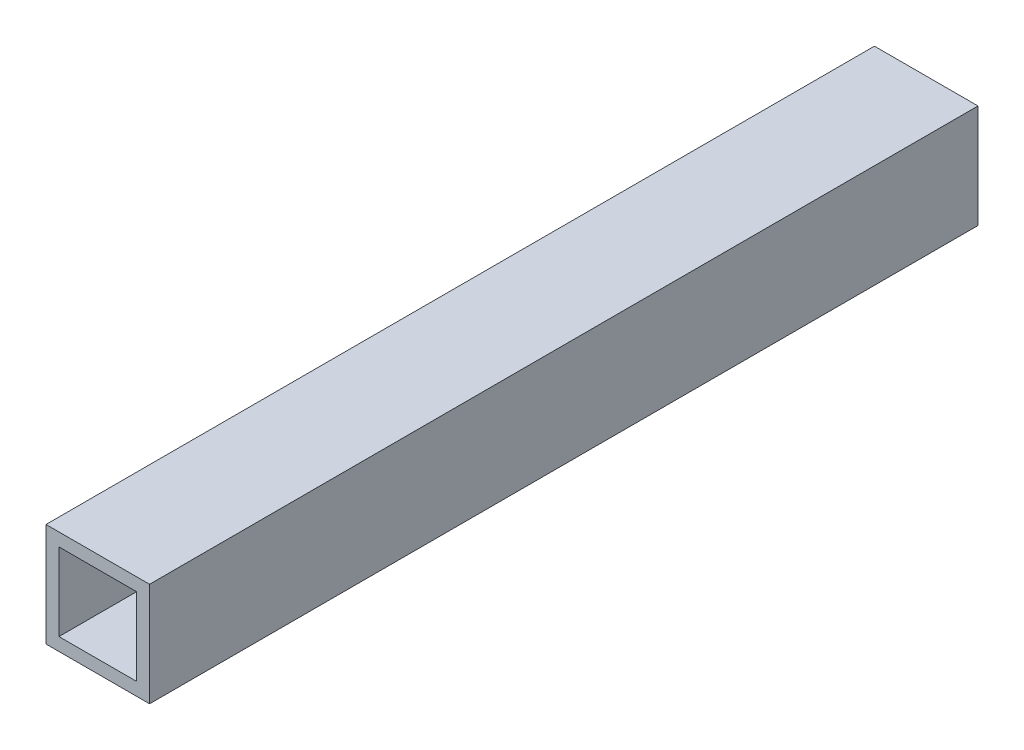
ISO-10303-21;
HEADER;
FILE_DESCRIPTION(('STEP AP214'),'2;1');
FILE_NAME('part.step','',(''),(''),'','','');
FILE_SCHEMA(('AUTOMOTIVE_DESIGN { 1 0 10303 214 1 1 1 1 }'));
ENDSEC;
DATA;
#1=APPLICATION_CONTEXT('core data for automotive mechanical design processes');
#2=APPLICATION_PROTOCOL_DEFINITION('international standard','automotive_design',2000,#1);
#3=PRODUCT_CONTEXT('',#1,'mechanical');
#4=PRODUCT('Part','Part','',(#3));
#5=PRODUCT_RELATED_PRODUCT_CATEGORY('part','',(#4));
#6=PRODUCT_DEFINITION_FORMATION('','',#4);
#7=PRODUCT_DEFINITION_CONTEXT('part definition',#1,'design');
#8=PRODUCT_DEFINITION('design','',#6,#7);
#9=PRODUCT_DEFINITION_SHAPE('','',#8);
#10=(LENGTH_UNIT() NAMED_UNIT(*) SI_UNIT(.MILLI.,.METRE.));
#11=(NAMED_UNIT(*) PLANE_ANGLE_UNIT() SI_UNIT($,.RADIAN.));
#12=(NAMED_UNIT(*) SI_UNIT($,.STERADIAN.) SOLID_ANGLE_UNIT());
#13=UNCERTAINTY_MEASURE_WITH_UNIT(LENGTH_MEASURE(1.E-05),#10,'distance_accuracy_value','');
#14=(GEOMETRIC_REPRESENTATION_CONTEXT(3) GLOBAL_UNCERTAINTY_ASSIGNED_CONTEXT((#13)) GLOBAL_UNIT_ASSIGNED_CONTEXT((#10,
#11,#12)) REPRESENTATION_CONTEXT('',''));
#15=CARTESIAN_POINT('',(0.,0.,0.));
#16=DIRECTION('',(0.,0.,1.));
#17=DIRECTION('',(1.,0.,0.));
#18=AXIS2_PLACEMENT_3D('',#15,#16,#17);
#19=CARTESIAN_POINT('',(0.,0.,203.2));
#20=DIRECTION('',(0.,0.,1.));
#21=DIRECTION('',(1.,0.,0.));
#22=AXIS2_PLACEMENT_3D('',#19,#20,#21);
#23=PLANE('',#22);
#24=DIRECTION('',(0.,-1.,0.));
#25=VECTOR('',#24,1.);
#26=CARTESIAN_POINT('',(-12.7,-12.7,203.2));
#27=LINE('',#26,#25);
#28=CARTESIAN_POINT('',(-12.7,12.7,203.2));
#29=VERTEX_POINT('',#28);
#30=CARTESIAN_POINT('',(-12.7,-12.7,203.2));
#31=VERTEX_POINT('',#30);
#32=EDGE_CURVE('E133',#29,#31,#27,.T.);
#33=ORIENTED_EDGE('',*,*,#32,.T.);
#34=DIRECTION('',(1.,0.,0.));
#35=VECTOR('',#34,1.);
#36=CARTESIAN_POINT('',(12.7,-12.7,203.2));
#37=LINE('',#36,#35);
#38=CARTESIAN_POINT('',(12.7,-12.7,203.2));
#39=VERTEX_POINT('',#38);
#40=EDGE_CURVE('E136',#31,#39,#37,.T.);
#41=ORIENTED_EDGE('',*,*,#40,.T.);
#42=DIRECTION('',(0.,1.,0.));
#43=VECTOR('',#42,1.);
#44=CARTESIAN_POINT('',(12.7,-12.7,203.2));
#45=LINE('',#44,#43);
#46=CARTESIAN_POINT('',(12.7,12.7,203.2));
#47=VERTEX_POINT('',#46);
#48=EDGE_CURVE('E139',#39,#47,#45,.T.);
#49=ORIENTED_EDGE('',*,*,#48,.T.);
#50=DIRECTION('',(-1.,0.,0.));
#51=VECTOR('',#50,1.);
#52=CARTESIAN_POINT('',(12.7,12.7,203.2));
#53=LINE('',#52,#51);
#54=EDGE_CURVE('E141',#47,#29,#53,.T.);
#55=ORIENTED_EDGE('',*,*,#54,.T.);
#56=EDGE_LOOP('',(#33,#41,#49,#55));
#57=FACE_BOUND('',#56,.T.);
#58=DIRECTION('',(1.,0.,0.));
#59=VECTOR('',#58,1.);
#60=CARTESIAN_POINT('',(9.525,-9.525,203.2));
#61=LINE('',#60,#59);
#62=CARTESIAN_POINT('',(-9.525,-9.525,203.2));
#63=VERTEX_POINT('',#62);
#64=CARTESIAN_POINT('',(9.525,-9.525,203.2));
#65=VERTEX_POINT('',#64);
#66=EDGE_CURVE('E105',#63,#65,#61,.T.);
#67=ORIENTED_EDGE('',*,*,#66,.F.);
#68=DIRECTION('',(0.,-1.,0.));
#69=VECTOR('',#68,1.);
#70=CARTESIAN_POINT('',(-9.525,-9.525,203.2));
#71=LINE('',#70,#69);
#72=CARTESIAN_POINT('',(-9.525,9.52500000000001,203.2));
#73=VERTEX_POINT('',#72);
#74=EDGE_CURVE('E97',#73,#63,#71,.T.);
#75=ORIENTED_EDGE('',*,*,#74,.F.);
#76=DIRECTION('',(-1.,0.,0.));
#77=VECTOR('',#76,1.);
#78=CARTESIAN_POINT('',(9.525,9.52500000000001,203.2));
#79=LINE('',#78,#77);
#80=CARTESIAN_POINT('',(9.525,9.52500000000001,203.2));
#81=VERTEX_POINT('',#80);
#82=EDGE_CURVE('E119',#81,#73,#79,.T.);
#83=ORIENTED_EDGE('',*,*,#82,.F.);
#84=DIRECTION('',(0.,1.,0.));
#85=VECTOR('',#84,1.);
#86=CARTESIAN_POINT('',(9.525,-9.525,203.2));
#87=LINE('',#86,#85);
#88=EDGE_CURVE('E117',#65,#81,#87,.T.);
#89=ORIENTED_EDGE('',*,*,#88,.F.);
#90=EDGE_LOOP('',(#67,#75,#83,#89));
#91=FACE_BOUND('',#90,.T.);
#92=ADVANCED_FACE('F32',(#57,#91),#23,.T.);
#93=CARTESIAN_POINT('',(0.,0.,0.));
#94=DIRECTION('',(0.,0.,1.));
#95=DIRECTION('',(1.,0.,0.));
#96=AXIS2_PLACEMENT_3D('',#93,#94,#95);
#97=PLANE('',#96);
#98=DIRECTION('',(0.,-1.,0.));
#99=VECTOR('',#98,1.);
#100=CARTESIAN_POINT('',(-12.7,-12.7,0.));
#101=LINE('',#100,#99);
#102=CARTESIAN_POINT('',(-12.7,12.7,0.));
#103=VERTEX_POINT('',#102);
#104=CARTESIAN_POINT('',(-12.7,-12.7,0.));
#105=VERTEX_POINT('',#104);
#106=EDGE_CURVE('E113',#103,#105,#101,.T.);
#107=ORIENTED_EDGE('',*,*,#106,.F.);
#108=DIRECTION('',(-1.,0.,0.));
#109=VECTOR('',#108,1.);
#110=CARTESIAN_POINT('',(12.7,12.7,0.));
#111=LINE('',#110,#109);
#112=CARTESIAN_POINT('',(12.7,12.7,0.));
#113=VERTEX_POINT('',#112);
#114=EDGE_CURVE('E137',#113,#103,#111,.T.);
#115=ORIENTED_EDGE('',*,*,#114,.F.);
#116=DIRECTION('',(0.,1.,0.));
#117=VECTOR('',#116,1.);
#118=CARTESIAN_POINT('',(12.7,-12.7,0.));
#119=LINE('',#118,#117);
#120=CARTESIAN_POINT('',(12.7,-12.7,0.));
#121=VERTEX_POINT('',#120);
#122=EDGE_CURVE('E148',#121,#113,#119,.T.);
#123=ORIENTED_EDGE('',*,*,#122,.F.);
#124=DIRECTION('',(1.,0.,0.));
#125=VECTOR('',#124,1.);
#126=CARTESIAN_POINT('',(12.7,-12.7,0.));
#127=LINE('',#126,#125);
#128=EDGE_CURVE('E146',#105,#121,#127,.T.);
#129=ORIENTED_EDGE('',*,*,#128,.F.);
#130=EDGE_LOOP('',(#107,#115,#123,#129));
#131=FACE_BOUND('',#130,.T.);
#132=DIRECTION('',(0.,-1.,0.));
#133=VECTOR('',#132,1.);
#134=CARTESIAN_POINT('',(-9.525,-9.525,0.));
#135=LINE('',#134,#133);
#136=CARTESIAN_POINT('',(-9.525,9.52500000000001,0.));
#137=VERTEX_POINT('',#136);
#138=CARTESIAN_POINT('',(-9.525,-9.525,0.));
#139=VERTEX_POINT('',#138);
#140=EDGE_CURVE('E55',#137,#139,#135,.T.);
#141=ORIENTED_EDGE('',*,*,#140,.T.);
#142=DIRECTION('',(1.,0.,0.));
#143=VECTOR('',#142,1.);
#144=CARTESIAN_POINT('',(9.525,-9.525,0.));
#145=LINE('',#144,#143);
#146=CARTESIAN_POINT('',(9.525,-9.525,0.));
#147=VERTEX_POINT('',#146);
#148=EDGE_CURVE('E112',#139,#147,#145,.T.);
#149=ORIENTED_EDGE('',*,*,#148,.T.);
#150=DIRECTION('',(0.,1.,0.));
#151=VECTOR('',#150,1.);
#152=CARTESIAN_POINT('',(9.525,-9.525,0.));
#153=LINE('',#152,#151);
#154=CARTESIAN_POINT('',(9.525,9.52500000000001,0.));
#155=VERTEX_POINT('',#154);
#156=EDGE_CURVE('E125',#147,#155,#153,.T.);
#157=ORIENTED_EDGE('',*,*,#156,.T.);
#158=DIRECTION('',(-1.,0.,0.));
#159=VECTOR('',#158,1.);
#160=CARTESIAN_POINT('',(9.525,9.52500000000001,0.));
#161=LINE('',#160,#159);
#162=EDGE_CURVE('E106',#155,#137,#161,.T.);
#163=ORIENTED_EDGE('',*,*,#162,.T.);
#164=EDGE_LOOP('',(#141,#149,#157,#163));
#165=FACE_BOUND('',#164,.T.);
#166=ADVANCED_FACE('F166',(#131,#165),#97,.F.);
#167=CARTESIAN_POINT('',(-12.7,-12.7,203.2));
#168=DIRECTION('',(1.,0.,0.));
#169=DIRECTION('',(0.,0.,-1.));
#170=AXIS2_PLACEMENT_3D('',#167,#168,#169);
#171=PLANE('',#170);
#172=ORIENTED_EDGE('',*,*,#106,.T.);
#173=DIRECTION('',(0.,0.,-1.));
#174=VECTOR('',#173,1.);
#175=CARTESIAN_POINT('',(-12.7,-12.7,203.2));
#176=LINE('',#175,#174);
#177=EDGE_CURVE('E11',#31,#105,#176,.T.);
#178=ORIENTED_EDGE('',*,*,#177,.F.);
#179=ORIENTED_EDGE('',*,*,#32,.F.);
#180=DIRECTION('',(0.,0.,-1.));
#181=VECTOR('',#180,1.);
#182=CARTESIAN_POINT('',(-12.7,12.7,203.2));
#183=LINE('',#182,#181);
#184=EDGE_CURVE('E143',#29,#103,#183,.T.);
#185=ORIENTED_EDGE('',*,*,#184,.T.);
#186=EDGE_LOOP('',(#172,#178,#179,#185));
#187=FACE_BOUND('',#186,.T.);
#188=ADVANCED_FACE('F34',(#187),#171,.F.);
#189=CARTESIAN_POINT('',(12.7,-12.7,203.2));
#190=DIRECTION('',(0.,1.,0.));
#191=DIRECTION('',(0.,0.,1.));
#192=AXIS2_PLACEMENT_3D('',#189,#190,#191);
#193=PLANE('',#192);
#194=ORIENTED_EDGE('',*,*,#128,.T.);
#195=DIRECTION('',(0.,0.,-1.));
#196=VECTOR('',#195,1.);
#197=CARTESIAN_POINT('',(12.7,-12.7,203.2));
#198=LINE('',#197,#196);
#199=EDGE_CURVE('E40',#39,#121,#198,.T.);
#200=ORIENTED_EDGE('',*,*,#199,.F.);
#201=ORIENTED_EDGE('',*,*,#40,.F.);
#202=ORIENTED_EDGE('',*,*,#177,.T.);
#203=EDGE_LOOP('',(#194,#200,#201,#202));
#204=FACE_BOUND('',#203,.T.);
#205=ADVANCED_FACE('F176',(#204),#193,.F.);
#206=CARTESIAN_POINT('',(12.7,-12.7,203.2));
#207=DIRECTION('',(-1.,0.,0.));
#208=DIRECTION('',(0.,0.,1.));
#209=AXIS2_PLACEMENT_3D('',#206,#207,#208);
#210=PLANE('',#209);
#211=ORIENTED_EDGE('',*,*,#122,.T.);
#212=DIRECTION('',(0.,0.,-1.));
#213=VECTOR('',#212,1.);
#214=CARTESIAN_POINT('',(12.7,12.7,203.2));
#215=LINE('',#214,#213);
#216=EDGE_CURVE('E153',#47,#113,#215,.T.);
#217=ORIENTED_EDGE('',*,*,#216,.F.);
#218=ORIENTED_EDGE('',*,*,#48,.F.);
#219=ORIENTED_EDGE('',*,*,#199,.T.);
#220=EDGE_LOOP('',(#211,#217,#218,#219));
#221=FACE_BOUND('',#220,.T.);
#222=ADVANCED_FACE('F160',(#221),#210,.F.);
#223=CARTESIAN_POINT('',(12.7,12.7,203.2));
#224=DIRECTION('',(0.,-1.,0.));
#225=DIRECTION('',(0.,0.,-1.));
#226=AXIS2_PLACEMENT_3D('',#223,#224,#225);
#227=PLANE('',#226);
#228=ORIENTED_EDGE('',*,*,#114,.T.);
#229=ORIENTED_EDGE('',*,*,#184,.F.);
#230=ORIENTED_EDGE('',*,*,#54,.F.);
#231=ORIENTED_EDGE('',*,*,#216,.T.);
#232=EDGE_LOOP('',(#228,#229,#230,#231));
#233=FACE_BOUND('',#232,.T.);
#234=ADVANCED_FACE('F170',(#233),#227,.F.);
#235=CARTESIAN_POINT('',(-9.525,-9.525,203.2));
#236=DIRECTION('',(1.,0.,0.));
#237=DIRECTION('',(0.,0.,-1.));
#238=AXIS2_PLACEMENT_3D('',#235,#236,#237);
#239=PLANE('',#238);
#240=ORIENTED_EDGE('',*,*,#140,.F.);
#241=DIRECTION('',(0.,0.,-1.));
#242=VECTOR('',#241,1.);
#243=CARTESIAN_POINT('',(-9.525,9.52500000000001,203.2));
#244=LINE('',#243,#242);
#245=EDGE_CURVE('E101',#73,#137,#244,.T.);
#246=ORIENTED_EDGE('',*,*,#245,.F.);
#247=ORIENTED_EDGE('',*,*,#74,.T.);
#248=DIRECTION('',(0.,0.,-1.));
#249=VECTOR('',#248,1.);
#250=CARTESIAN_POINT('',(-9.525,-9.525,203.2));
#251=LINE('',#250,#249);
#252=EDGE_CURVE('E100',#63,#139,#251,.T.);
#253=ORIENTED_EDGE('',*,*,#252,.T.);
#254=EDGE_LOOP('',(#240,#246,#247,#253));
#255=FACE_BOUND('',#254,.T.);
#256=ADVANCED_FACE('F99',(#255),#239,.T.);
#257=CARTESIAN_POINT('',(9.525,-9.525,203.2));
#258=DIRECTION('',(0.,1.,0.));
#259=DIRECTION('',(0.,0.,1.));
#260=AXIS2_PLACEMENT_3D('',#257,#258,#259);
#261=PLANE('',#260);
#262=ORIENTED_EDGE('',*,*,#148,.F.);
#263=ORIENTED_EDGE('',*,*,#252,.F.);
#264=ORIENTED_EDGE('',*,*,#66,.T.);
#265=DIRECTION('',(0.,0.,-1.));
#266=VECTOR('',#265,1.);
#267=CARTESIAN_POINT('',(9.525,-9.525,203.2));
#268=LINE('',#267,#266);
#269=EDGE_CURVE('E114',#65,#147,#268,.T.);
#270=ORIENTED_EDGE('',*,*,#269,.T.);
#271=EDGE_LOOP('',(#262,#263,#264,#270));
#272=FACE_BOUND('',#271,.T.);
#273=ADVANCED_FACE('F109',(#272),#261,.T.);
#274=CARTESIAN_POINT('',(9.525,-9.525,203.2));
#275=DIRECTION('',(-1.,0.,0.));
#276=DIRECTION('',(0.,0.,1.));
#277=AXIS2_PLACEMENT_3D('',#274,#275,#276);
#278=PLANE('',#277);
#279=ORIENTED_EDGE('',*,*,#156,.F.);
#280=ORIENTED_EDGE('',*,*,#269,.F.);
#281=ORIENTED_EDGE('',*,*,#88,.T.);
#282=DIRECTION('',(0.,0.,-1.));
#283=VECTOR('',#282,1.);
#284=CARTESIAN_POINT('',(9.525,9.52500000000001,203.2));
#285=LINE('',#284,#283);
#286=EDGE_CURVE('E47',#81,#155,#285,.T.);
#287=ORIENTED_EDGE('',*,*,#286,.T.);
#288=EDGE_LOOP('',(#279,#280,#281,#287));
#289=FACE_BOUND('',#288,.T.);
#290=ADVANCED_FACE('F199',(#289),#278,.T.);
#291=CARTESIAN_POINT('',(9.525,9.52500000000001,203.2));
#292=DIRECTION('',(0.,-1.,0.));
#293=DIRECTION('',(0.,0.,-1.));
#294=AXIS2_PLACEMENT_3D('',#291,#292,#293);
#295=PLANE('',#294);
#296=ORIENTED_EDGE('',*,*,#162,.F.);
#297=ORIENTED_EDGE('',*,*,#286,.F.);
#298=ORIENTED_EDGE('',*,*,#82,.T.);
#299=ORIENTED_EDGE('',*,*,#245,.T.);
#300=EDGE_LOOP('',(#296,#297,#298,#299));
#301=FACE_BOUND('',#300,.T.);
#302=ADVANCED_FACE('F203',(#301),#295,.T.);
#303=CLOSED_SHELL('',(#92,#166,#188,#205,#222,#234,#256,#273,#290,#302));
#304=MANIFOLD_SOLID_BREP('B2',#303);
#305=ADVANCED_BREP_SHAPE_REPRESENTATION('',(#18,#304),#14);
#306=SHAPE_DEFINITION_REPRESENTATION(#9,#305);
ENDSEC;
END-ISO-10303-21;
